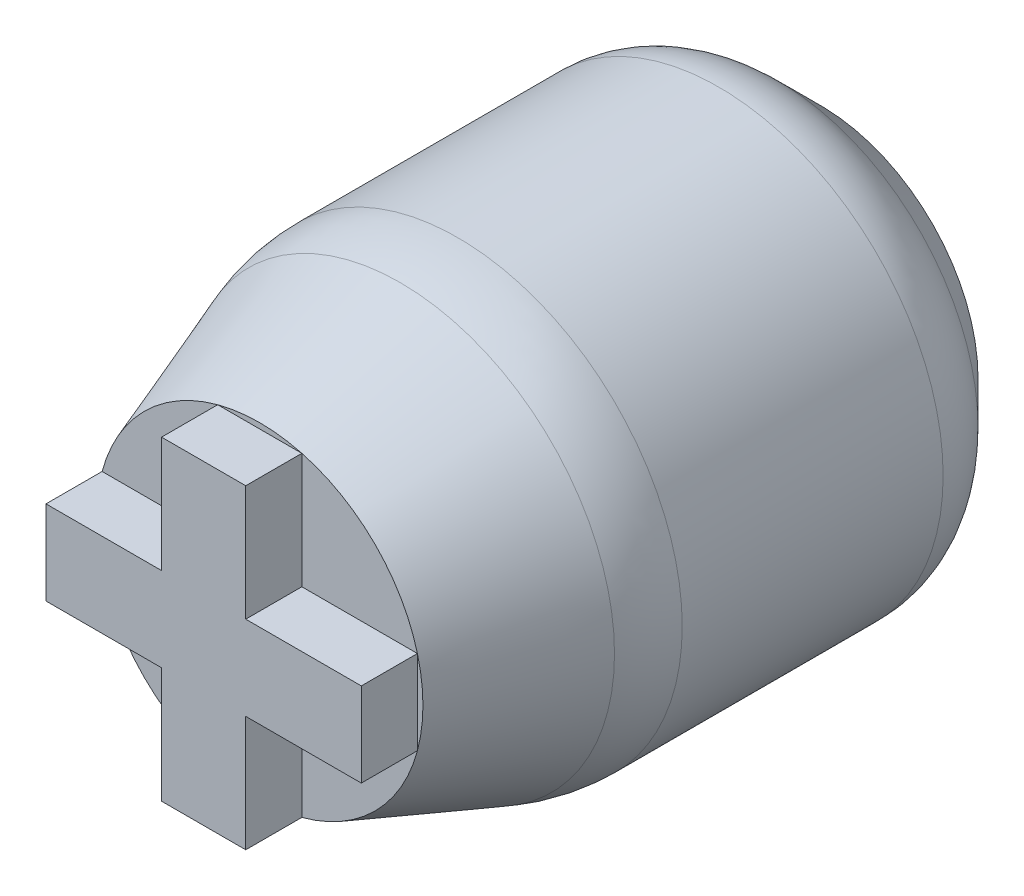
ISO-10303-21;
HEADER;
FILE_DESCRIPTION(('STEP AP214'),'2;1');
FILE_NAME('part.step','',(''),(''),'','','');
FILE_SCHEMA(('AUTOMOTIVE_DESIGN { 1 0 10303 214 1 1 1 1 }'));
ENDSEC;
DATA;
#1=APPLICATION_CONTEXT('core data for automotive mechanical design processes');
#2=APPLICATION_PROTOCOL_DEFINITION('international standard','automotive_design',2000,#1);
#3=PRODUCT_CONTEXT('',#1,'mechanical');
#4=PRODUCT('Part','Part','',(#3));
#5=PRODUCT_RELATED_PRODUCT_CATEGORY('part','',(#4));
#6=PRODUCT_DEFINITION_FORMATION('','',#4);
#7=PRODUCT_DEFINITION_CONTEXT('part definition',#1,'design');
#8=PRODUCT_DEFINITION('design','',#6,#7);
#9=PRODUCT_DEFINITION_SHAPE('','',#8);
#10=(LENGTH_UNIT() NAMED_UNIT(*) SI_UNIT(.MILLI.,.METRE.));
#11=(NAMED_UNIT(*) PLANE_ANGLE_UNIT() SI_UNIT($,.RADIAN.));
#12=(NAMED_UNIT(*) SI_UNIT($,.STERADIAN.) SOLID_ANGLE_UNIT());
#13=UNCERTAINTY_MEASURE_WITH_UNIT(LENGTH_MEASURE(1.E-05),#10,'distance_accuracy_value','');
#14=(GEOMETRIC_REPRESENTATION_CONTEXT(3) GLOBAL_UNCERTAINTY_ASSIGNED_CONTEXT((#13)) GLOBAL_UNIT_ASSIGNED_CONTEXT((#10,
#11,#12)) REPRESENTATION_CONTEXT('',''));
#15=CARTESIAN_POINT('',(0.,0.,0.));
#16=DIRECTION('',(0.,0.,1.));
#17=DIRECTION('',(1.,0.,0.));
#18=AXIS2_PLACEMENT_3D('',#15,#16,#17);
#19=CARTESIAN_POINT('',(0.,0.,10.));
#20=DIRECTION('',(0.,0.,1.));
#21=DIRECTION('',(1.,0.,0.));
#22=AXIS2_PLACEMENT_3D('',#19,#20,#21);
#23=PLANE('',#22);
#24=DIRECTION('',(0.,-1.,0.));
#25=VECTOR('',#24,1.);
#26=CARTESIAN_POINT('',(-2.80971232700027,-0.75,10.));
#27=LINE('',#26,#25);
#28=CARTESIAN_POINT('',(-2.80971232700027,0.75,10.));
#29=VERTEX_POINT('',#28);
#30=CARTESIAN_POINT('',(-2.80971232700027,-0.75,10.));
#31=VERTEX_POINT('',#30);
#32=EDGE_CURVE('E159',#29,#31,#27,.T.);
#33=ORIENTED_EDGE('',*,*,#32,.F.);
#34=CARTESIAN_POINT('',(0.,0.,10.));
#35=DIRECTION('',(0.,0.,1.));
#36=DIRECTION('',(1.,0.,0.));
#37=AXIS2_PLACEMENT_3D('',#34,#35,#36);
#38=CIRCLE('',#37,2.90808929720139);
#39=EDGE_CURVE('E282',#29,#31,#38,.T.);
#40=ORIENTED_EDGE('',*,*,#39,.T.);
#41=EDGE_LOOP('',(#33,#40));
#42=FACE_BOUND('',#41,.T.);
#43=ADVANCED_FACE('F33',(#42),#23,.T.);
#44=DIRECTION('',(-1.,0.,0.));
#45=VECTOR('',#44,1.);
#46=CARTESIAN_POINT('',(-2.80971232700027,0.75,10.));
#47=LINE('',#46,#45);
#48=CARTESIAN_POINT('',(-0.75,0.75,10.));
#49=VERTEX_POINT('',#48);
#50=EDGE_CURVE('E48',#49,#29,#47,.T.);
#51=ORIENTED_EDGE('',*,*,#50,.F.);
#52=DIRECTION('',(0.,-1.,0.));
#53=VECTOR('',#52,1.);
#54=CARTESIAN_POINT('',(-0.75,0.75,10.));
#55=LINE('',#54,#53);
#56=CARTESIAN_POINT('',(-0.750000000000001,2.80971232700027,10.));
#57=VERTEX_POINT('',#56);
#58=EDGE_CURVE('E317',#57,#49,#55,.T.);
#59=ORIENTED_EDGE('',*,*,#58,.F.);
#60=EDGE_CURVE('E597',#57,#29,#38,.T.);
#61=ORIENTED_EDGE('',*,*,#60,.T.);
#62=EDGE_LOOP('',(#51,#59,#61));
#63=FACE_BOUND('',#62,.T.);
#64=ADVANCED_FACE('F235',(#63),#23,.T.);
#65=DIRECTION('',(-1.,0.,0.));
#66=VECTOR('',#65,1.);
#67=CARTESIAN_POINT('',(-0.75,2.80971232700027,10.));
#68=LINE('',#67,#66);
#69=CARTESIAN_POINT('',(0.75,2.80971232700027,10.));
#70=VERTEX_POINT('',#69);
#71=EDGE_CURVE('E319',#70,#57,#68,.T.);
#72=ORIENTED_EDGE('',*,*,#71,.F.);
#73=EDGE_CURVE('E185',#70,#57,#38,.T.);
#74=ORIENTED_EDGE('',*,*,#73,.T.);
#75=EDGE_LOOP('',(#72,#74));
#76=FACE_BOUND('',#75,.T.);
#77=ADVANCED_FACE('F241',(#76),#23,.T.);
#78=DIRECTION('',(0.,1.,0.));
#79=VECTOR('',#78,1.);
#80=CARTESIAN_POINT('',(0.75,2.80971232700027,10.));
#81=LINE('',#80,#79);
#82=CARTESIAN_POINT('',(0.75,0.75,10.));
#83=VERTEX_POINT('',#82);
#84=EDGE_CURVE('E56',#83,#70,#81,.T.);
#85=ORIENTED_EDGE('',*,*,#84,.F.);
#86=DIRECTION('',(-1.,0.,0.));
#87=VECTOR('',#86,1.);
#88=CARTESIAN_POINT('',(0.75,0.75,10.));
#89=LINE('',#88,#87);
#90=CARTESIAN_POINT('',(2.80971232700027,0.750000000000001,10.));
#91=VERTEX_POINT('',#90);
#92=EDGE_CURVE('E323',#91,#83,#89,.T.);
#93=ORIENTED_EDGE('',*,*,#92,.F.);
#94=EDGE_CURVE('E182',#91,#70,#38,.T.);
#95=ORIENTED_EDGE('',*,*,#94,.T.);
#96=EDGE_LOOP('',(#85,#93,#95));
#97=FACE_BOUND('',#96,.T.);
#98=ADVANCED_FACE('F502',(#97),#23,.T.);
#99=DIRECTION('',(0.,1.,0.));
#100=VECTOR('',#99,1.);
#101=CARTESIAN_POINT('',(2.80971232700027,0.75,10.));
#102=LINE('',#101,#100);
#103=CARTESIAN_POINT('',(2.80971232700027,-0.75,10.));
#104=VERTEX_POINT('',#103);
#105=EDGE_CURVE('E325',#104,#91,#102,.T.);
#106=ORIENTED_EDGE('',*,*,#105,.F.);
#107=EDGE_CURVE('E179',#104,#91,#38,.T.);
#108=ORIENTED_EDGE('',*,*,#107,.T.);
#109=EDGE_LOOP('',(#106,#108));
#110=FACE_BOUND('',#109,.T.);
#111=ADVANCED_FACE('F255',(#110),#23,.T.);
#112=DIRECTION('',(1.,0.,0.));
#113=VECTOR('',#112,1.);
#114=CARTESIAN_POINT('',(2.80971232700027,-0.75,10.));
#115=LINE('',#114,#113);
#116=CARTESIAN_POINT('',(0.75,-0.75,10.));
#117=VERTEX_POINT('',#116);
#118=EDGE_CURVE('E328',#117,#104,#115,.T.);
#119=ORIENTED_EDGE('',*,*,#118,.F.);
#120=DIRECTION('',(0.,1.,0.));
#121=VECTOR('',#120,1.);
#122=CARTESIAN_POINT('',(0.75,-0.75,10.));
#123=LINE('',#122,#121);
#124=CARTESIAN_POINT('',(0.750000000000001,-2.80971232700027,10.));
#125=VERTEX_POINT('',#124);
#126=EDGE_CURVE('E266',#125,#117,#123,.T.);
#127=ORIENTED_EDGE('',*,*,#126,.F.);
#128=EDGE_CURVE('E279',#125,#104,#38,.T.);
#129=ORIENTED_EDGE('',*,*,#128,.T.);
#130=EDGE_LOOP('',(#119,#127,#129));
#131=FACE_BOUND('',#130,.T.);
#132=ADVANCED_FACE('F250',(#131),#23,.T.);
#133=DIRECTION('',(1.,0.,0.));
#134=VECTOR('',#133,1.);
#135=CARTESIAN_POINT('',(0.75,-2.80971232700027,10.));
#136=LINE('',#135,#134);
#137=CARTESIAN_POINT('',(-0.75,-2.80971232700027,10.));
#138=VERTEX_POINT('',#137);
#139=EDGE_CURVE('E259',#138,#125,#136,.T.);
#140=ORIENTED_EDGE('',*,*,#139,.F.);
#141=EDGE_CURVE('E261',#138,#125,#38,.T.);
#142=ORIENTED_EDGE('',*,*,#141,.T.);
#143=EDGE_LOOP('',(#140,#142));
#144=FACE_BOUND('',#143,.T.);
#145=ADVANCED_FACE('F202',(#144),#23,.T.);
#146=CARTESIAN_POINT('',(0.,0.,1.82132034355964));
#147=DIRECTION('',(0.,0.,-1.));
#148=DIRECTION('',(-1.,0.,0.));
#149=AXIS2_PLACEMENT_3D('',#146,#147,#148);
#150=TOROIDAL_SURFACE('',#149,2.5,1.5);
#151=CARTESIAN_POINT('',(0.,0.,1.82132034355964));
#152=DIRECTION('',(0.,0.,-1.));
#153=DIRECTION('',(-1.,0.,0.));
#154=AXIS2_PLACEMENT_3D('',#151,#152,#153);
#155=CIRCLE('',#154,4.);
#156=CARTESIAN_POINT('',(-4.,0.,1.82132034355964));
#157=VERTEX_POINT('',#156);
#158=EDGE_CURVE('E41',#157,#157,#155,.F.);
#159=ORIENTED_EDGE('',*,*,#158,.F.);
#160=EDGE_LOOP('',(#159));
#161=FACE_BOUND('',#160,.T.);
#162=CARTESIAN_POINT('',(0.,0.,0.760660171779819));
#163=DIRECTION('',(0.,0.,1.));
#164=DIRECTION('',(1.,0.,0.));
#165=AXIS2_PLACEMENT_3D('',#162,#163,#164);
#166=CIRCLE('',#165,3.56066017177982);
#167=CARTESIAN_POINT('',(3.56066017177982,0.,0.760660171779819));
#168=VERTEX_POINT('',#167);
#169=EDGE_CURVE('E11',#168,#168,#166,.F.);
#170=ORIENTED_EDGE('',*,*,#169,.F.);
#171=EDGE_LOOP('',(#170));
#172=FACE_BOUND('',#171,.T.);
#173=ADVANCED_FACE('F35',(#161,#172),#150,.T.);
#174=CARTESIAN_POINT('',(0.,0.,6.47101905787458));
#175=DIRECTION('',(0.,0.,-1.));
#176=DIRECTION('',(-1.,0.,0.));
#177=AXIS2_PLACEMENT_3D('',#174,#175,#176);
#178=DEGENERATE_TOROIDAL_SURFACE('',#177,1.,3.,.T.);
#179=CARTESIAN_POINT('',(0.,0.,7.49707948785158));
#180=DIRECTION('',(0.,0.,-1.));
#181=DIRECTION('',(-1.,0.,0.));
#182=AXIS2_PLACEMENT_3D('',#179,#180,#181);
#183=CIRCLE('',#182,3.81907786235773);
#184=CARTESIAN_POINT('',(-3.81907786235773,0.,7.49707948785158));
#185=VERTEX_POINT('',#184);
#186=EDGE_CURVE('E188',#185,#185,#183,.F.);
#187=ORIENTED_EDGE('',*,*,#186,.F.);
#188=EDGE_LOOP('',(#187));
#189=FACE_BOUND('',#188,.T.);
#190=CARTESIAN_POINT('',(0.,0.,6.47101905787458));
#191=DIRECTION('',(0.,0.,-1.));
#192=DIRECTION('',(-1.,0.,0.));
#193=AXIS2_PLACEMENT_3D('',#190,#191,#192);
#194=CIRCLE('',#193,4.);
#195=CARTESIAN_POINT('',(-4.,0.,6.47101905787458));
#196=VERTEX_POINT('',#195);
#197=EDGE_CURVE('E191',#196,#196,#194,.T.);
#198=ORIENTED_EDGE('',*,*,#197,.F.);
#199=EDGE_LOOP('',(#198));
#200=FACE_BOUND('',#199,.T.);
#201=ADVANCED_FACE('F201',(#189,#200),#178,.T.);
#202=CARTESIAN_POINT('',(0.,0.,10.));
#203=DIRECTION('',(0.,0.,-1.));
#204=DIRECTION('',(-1.,0.,0.));
#205=AXIS2_PLACEMENT_3D('',#202,#203,#204);
#206=CYLINDRICAL_SURFACE('',#205,4.);
#207=ORIENTED_EDGE('',*,*,#158,.T.);
#208=EDGE_LOOP('',(#207));
#209=FACE_BOUND('',#208,.T.);
#210=ORIENTED_EDGE('',*,*,#197,.T.);
#211=EDGE_LOOP('',(#210));
#212=FACE_BOUND('',#211,.T.);
#213=ADVANCED_FACE('F196',(#209,#212),#206,.T.);
#214=DIRECTION('',(0.,-1.,0.));
#215=VECTOR('',#214,1.);
#216=CARTESIAN_POINT('',(-0.75,-2.80971232700027,10.));
#217=LINE('',#216,#215);
#218=CARTESIAN_POINT('',(-0.75,-0.75,10.));
#219=VERTEX_POINT('',#218);
#220=EDGE_CURVE('E267',#219,#138,#217,.T.);
#221=ORIENTED_EDGE('',*,*,#220,.F.);
#222=DIRECTION('',(1.,0.,0.));
#223=VECTOR('',#222,1.);
#224=CARTESIAN_POINT('',(-0.75,-0.75,10.));
#225=LINE('',#224,#223);
#226=EDGE_CURVE('E281',#31,#219,#225,.T.);
#227=ORIENTED_EDGE('',*,*,#226,.F.);
#228=EDGE_CURVE('E275',#31,#138,#38,.T.);
#229=ORIENTED_EDGE('',*,*,#228,.T.);
#230=EDGE_LOOP('',(#221,#227,#229));
#231=FACE_BOUND('',#230,.T.);
#232=ADVANCED_FACE('F216',(#231),#23,.T.);
#233=CARTESIAN_POINT('',(0.,0.,0.));
#234=DIRECTION('',(0.,0.,1.));
#235=DIRECTION('',(1.,0.,0.));
#236=AXIS2_PLACEMENT_3D('',#233,#234,#235);
#237=PLANE('',#236);
#238=CARTESIAN_POINT('',(0.,0.,0.));
#239=DIRECTION('',(0.,0.,1.));
#240=DIRECTION('',(1.,0.,0.));
#241=AXIS2_PLACEMENT_3D('',#238,#239,#240);
#242=CIRCLE('',#241,2.8);
#243=CARTESIAN_POINT('',(2.8,0.,0.));
#244=VERTEX_POINT('',#243);
#245=EDGE_CURVE('E184',#244,#244,#242,.F.);
#246=ORIENTED_EDGE('',*,*,#245,.T.);
#247=EDGE_LOOP('',(#246));
#248=FACE_BOUND('',#247,.T.);
#249=DIRECTION('',(-1.,0.,0.));
#250=VECTOR('',#249,1.);
#251=CARTESIAN_POINT('',(1.2328828005938,-0.55,0.));
#252=LINE('',#251,#250);
#253=CARTESIAN_POINT('',(1.2328828005938,-0.55,0.));
#254=VERTEX_POINT('',#253);
#255=CARTESIAN_POINT('',(-1.2328828005938,-0.55,0.));
#256=VERTEX_POINT('',#255);
#257=EDGE_CURVE('E162',#254,#256,#252,.T.);
#258=ORIENTED_EDGE('',*,*,#257,.F.);
#259=CARTESIAN_POINT('',(0.,0.,0.));
#260=DIRECTION('',(0.,0.,-1.));
#261=DIRECTION('',(-1.,0.,0.));
#262=AXIS2_PLACEMENT_3D('',#259,#260,#261);
#263=CIRCLE('',#262,1.35);
#264=EDGE_CURVE('E160',#256,#254,#263,.T.);
#265=ORIENTED_EDGE('',*,*,#264,.F.);
#266=EDGE_LOOP('',(#258,#265));
#267=FACE_BOUND('',#266,.T.);
#268=ADVANCED_FACE('F212',(#248,#267),#237,.F.);
#269=CARTESIAN_POINT('',(0.,0.,10.));
#270=DIRECTION('',(0.,0.,-1.));
#271=DIRECTION('',(-1.,0.,0.));
#272=AXIS2_PLACEMENT_3D('',#269,#270,#271);
#273=CONICAL_SURFACE('',#272,2.90808929720139,0.349065850398863);
#274=ORIENTED_EDGE('',*,*,#186,.T.);
#275=EDGE_LOOP('',(#274));
#276=FACE_BOUND('',#275,.T.);
#277=ORIENTED_EDGE('',*,*,#94,.F.);
#278=ORIENTED_EDGE('',*,*,#107,.F.);
#279=ORIENTED_EDGE('',*,*,#128,.F.);
#280=ORIENTED_EDGE('',*,*,#141,.F.);
#281=ORIENTED_EDGE('',*,*,#228,.F.);
#282=ORIENTED_EDGE('',*,*,#39,.F.);
#283=ORIENTED_EDGE('',*,*,#60,.F.);
#284=ORIENTED_EDGE('',*,*,#73,.F.);
#285=EDGE_LOOP('',(#277,#278,#279,#280,#281,#282,#283,#284));
#286=FACE_BOUND('',#285,.T.);
#287=ADVANCED_FACE('F215',(#276,#286),#273,.T.);
#288=CARTESIAN_POINT('',(0.,0.,6.));
#289=DIRECTION('',(0.,0.,-1.));
#290=DIRECTION('',(-1.,0.,0.));
#291=AXIS2_PLACEMENT_3D('',#288,#289,#290);
#292=CYLINDRICAL_SURFACE('',#291,1.35);
#293=ORIENTED_EDGE('',*,*,#264,.T.);
#294=DIRECTION('',(0.,0.,-1.));
#295=VECTOR('',#294,1.);
#296=CARTESIAN_POINT('',(1.2328828005938,-0.55,6.));
#297=LINE('',#296,#295);
#298=CARTESIAN_POINT('',(1.2328828005938,-0.55,6.));
#299=VERTEX_POINT('',#298);
#300=EDGE_CURVE('E173',#299,#254,#297,.T.);
#301=ORIENTED_EDGE('',*,*,#300,.F.);
#302=CARTESIAN_POINT('',(0.,0.,6.));
#303=DIRECTION('',(0.,0.,-1.));
#304=DIRECTION('',(-1.,0.,0.));
#305=AXIS2_PLACEMENT_3D('',#302,#303,#304);
#306=CIRCLE('',#305,1.35);
#307=CARTESIAN_POINT('',(-1.2328828005938,-0.55,6.));
#308=VERTEX_POINT('',#307);
#309=EDGE_CURVE('E168',#308,#299,#306,.T.);
#310=ORIENTED_EDGE('',*,*,#309,.F.);
#311=DIRECTION('',(0.,0.,-1.));
#312=VECTOR('',#311,1.);
#313=CARTESIAN_POINT('',(-1.2328828005938,-0.55,6.));
#314=LINE('',#313,#312);
#315=EDGE_CURVE('E177',#308,#256,#314,.T.);
#316=ORIENTED_EDGE('',*,*,#315,.T.);
#317=EDGE_LOOP('',(#293,#301,#310,#316));
#318=FACE_BOUND('',#317,.T.);
#319=ADVANCED_FACE('F225',(#318),#292,.F.);
#320=CARTESIAN_POINT('',(1.2328828005938,-0.55,6.));
#321=DIRECTION('',(0.,-1.,0.));
#322=DIRECTION('',(0.,0.,-1.));
#323=AXIS2_PLACEMENT_3D('',#320,#321,#322);
#324=PLANE('',#323);
#325=ORIENTED_EDGE('',*,*,#257,.T.);
#326=ORIENTED_EDGE('',*,*,#315,.F.);
#327=DIRECTION('',(-1.,0.,0.));
#328=VECTOR('',#327,1.);
#329=CARTESIAN_POINT('',(1.2328828005938,-0.55,6.));
#330=LINE('',#329,#328);
#331=EDGE_CURVE('E171',#299,#308,#330,.T.);
#332=ORIENTED_EDGE('',*,*,#331,.F.);
#333=ORIENTED_EDGE('',*,*,#300,.T.);
#334=EDGE_LOOP('',(#325,#326,#332,#333));
#335=FACE_BOUND('',#334,.T.);
#336=ADVANCED_FACE('F221',(#335),#324,.F.);
#337=CARTESIAN_POINT('',(0.,0.,6.));
#338=DIRECTION('',(0.,0.,-1.));
#339=DIRECTION('',(-1.,0.,0.));
#340=AXIS2_PLACEMENT_3D('',#337,#338,#339);
#341=PLANE('',#340);
#342=ORIENTED_EDGE('',*,*,#309,.T.);
#343=ORIENTED_EDGE('',*,*,#331,.T.);
#344=EDGE_LOOP('',(#342,#343));
#345=FACE_BOUND('',#344,.T.);
#346=ADVANCED_FACE('F208',(#345),#341,.T.);
#347=CARTESIAN_POINT('',(0.,0.,1.2));
#348=DIRECTION('',(0.,0.,1.));
#349=DIRECTION('',(1.,0.,0.));
#350=AXIS2_PLACEMENT_3D('',#347,#348,#349);
#351=CONICAL_SURFACE('',#350,4.,0.78539816339745);
#352=ORIENTED_EDGE('',*,*,#169,.T.);
#353=EDGE_LOOP('',(#352));
#354=FACE_BOUND('',#353,.T.);
#355=ORIENTED_EDGE('',*,*,#245,.F.);
#356=EDGE_LOOP('',(#355));
#357=FACE_BOUND('',#356,.T.);
#358=ADVANCED_FACE('F205',(#354,#357),#351,.T.);
#359=CARTESIAN_POINT('',(-2.80971232700027,-0.75,11.));
#360=DIRECTION('',(1.,0.,0.));
#361=DIRECTION('',(0.,0.,-1.));
#362=AXIS2_PLACEMENT_3D('',#359,#360,#361);
#363=PLANE('',#362);
#364=ORIENTED_EDGE('',*,*,#32,.T.);
#365=DIRECTION('',(0.,0.,-1.));
#366=VECTOR('',#365,1.);
#367=CARTESIAN_POINT('',(-2.80971232700027,-0.75,11.));
#368=LINE('',#367,#366);
#369=CARTESIAN_POINT('',(-2.80971232700027,-0.75,11.));
#370=VERTEX_POINT('',#369);
#371=EDGE_CURVE('E141',#370,#31,#368,.T.);
#372=ORIENTED_EDGE('',*,*,#371,.F.);
#373=DIRECTION('',(0.,-1.,0.));
#374=VECTOR('',#373,1.);
#375=CARTESIAN_POINT('',(-2.80971232700027,-0.75,11.));
#376=LINE('',#375,#374);
#377=CARTESIAN_POINT('',(-2.80971232700027,0.75,11.));
#378=VERTEX_POINT('',#377);
#379=EDGE_CURVE('E148',#378,#370,#376,.T.);
#380=ORIENTED_EDGE('',*,*,#379,.F.);
#381=DIRECTION('',(0.,0.,-1.));
#382=VECTOR('',#381,1.);
#383=CARTESIAN_POINT('',(-2.80971232700027,0.75,11.));
#384=LINE('',#383,#382);
#385=EDGE_CURVE('E314',#378,#29,#384,.T.);
#386=ORIENTED_EDGE('',*,*,#385,.T.);
#387=EDGE_LOOP('',(#364,#372,#380,#386));
#388=FACE_BOUND('',#387,.T.);
#389=ADVANCED_FACE('F158',(#388),#363,.F.);
#390=CARTESIAN_POINT('',(-0.75,-0.75,11.));
#391=DIRECTION('',(0.,1.,0.));
#392=DIRECTION('',(-1.,0.,0.));
#393=AXIS2_PLACEMENT_3D('',#390,#391,#392);
#394=PLANE('',#393);
#395=ORIENTED_EDGE('',*,*,#226,.T.);
#396=DIRECTION('',(0.,0.,-1.));
#397=VECTOR('',#396,1.);
#398=CARTESIAN_POINT('',(-0.75,-0.75,11.));
#399=LINE('',#398,#397);
#400=CARTESIAN_POINT('',(-0.75,-0.75,11.));
#401=VERTEX_POINT('',#400);
#402=EDGE_CURVE('E144',#401,#219,#399,.T.);
#403=ORIENTED_EDGE('',*,*,#402,.F.);
#404=DIRECTION('',(1.,0.,0.));
#405=VECTOR('',#404,1.);
#406=CARTESIAN_POINT('',(-0.75,-0.75,11.));
#407=LINE('',#406,#405);
#408=EDGE_CURVE('E136',#370,#401,#407,.T.);
#409=ORIENTED_EDGE('',*,*,#408,.F.);
#410=ORIENTED_EDGE('',*,*,#371,.T.);
#411=EDGE_LOOP('',(#395,#403,#409,#410));
#412=FACE_BOUND('',#411,.T.);
#413=ADVANCED_FACE('F139',(#412),#394,.F.);
#414=CARTESIAN_POINT('',(-0.75,-2.80971232700027,11.));
#415=DIRECTION('',(1.,0.,0.));
#416=DIRECTION('',(0.,0.,-1.));
#417=AXIS2_PLACEMENT_3D('',#414,#415,#416);
#418=PLANE('',#417);
#419=ORIENTED_EDGE('',*,*,#220,.T.);
#420=DIRECTION('',(0.,0.,-1.));
#421=VECTOR('',#420,1.);
#422=CARTESIAN_POINT('',(-0.75,-2.80971232700027,11.));
#423=LINE('',#422,#421);
#424=CARTESIAN_POINT('',(-0.75,-2.80971232700027,11.));
#425=VERTEX_POINT('',#424);
#426=EDGE_CURVE('E164',#425,#138,#423,.T.);
#427=ORIENTED_EDGE('',*,*,#426,.F.);
#428=DIRECTION('',(0.,-1.,0.));
#429=VECTOR('',#428,1.);
#430=CARTESIAN_POINT('',(-0.75,-2.80971232700027,11.));
#431=LINE('',#430,#429);
#432=EDGE_CURVE('E147',#401,#425,#431,.T.);
#433=ORIENTED_EDGE('',*,*,#432,.F.);
#434=ORIENTED_EDGE('',*,*,#402,.T.);
#435=EDGE_LOOP('',(#419,#427,#433,#434));
#436=FACE_BOUND('',#435,.T.);
#437=ADVANCED_FACE('F285',(#436),#418,.F.);
#438=CARTESIAN_POINT('',(0.75,-2.80971232700027,11.));
#439=DIRECTION('',(0.,1.,0.));
#440=DIRECTION('',(0.,0.,1.));
#441=AXIS2_PLACEMENT_3D('',#438,#439,#440);
#442=PLANE('',#441);
#443=ORIENTED_EDGE('',*,*,#139,.T.);
#444=DIRECTION('',(0.,0.,-1.));
#445=VECTOR('',#444,1.);
#446=CARTESIAN_POINT('',(0.75,-2.80971232700027,11.));
#447=LINE('',#446,#445);
#448=CARTESIAN_POINT('',(0.75,-2.80971232700027,11.));
#449=VERTEX_POINT('',#448);
#450=EDGE_CURVE('E290',#449,#125,#447,.T.);
#451=ORIENTED_EDGE('',*,*,#450,.F.);
#452=DIRECTION('',(1.,0.,0.));
#453=VECTOR('',#452,1.);
#454=CARTESIAN_POINT('',(0.75,-2.80971232700027,11.));
#455=LINE('',#454,#453);
#456=EDGE_CURVE('E289',#425,#449,#455,.T.);
#457=ORIENTED_EDGE('',*,*,#456,.F.);
#458=ORIENTED_EDGE('',*,*,#426,.T.);
#459=EDGE_LOOP('',(#443,#451,#457,#458));
#460=FACE_BOUND('',#459,.T.);
#461=ADVANCED_FACE('F288',(#460),#442,.F.);
#462=CARTESIAN_POINT('',(0.75,-0.75,11.));
#463=DIRECTION('',(-1.,0.,0.));
#464=DIRECTION('',(0.,-1.,0.));
#465=AXIS2_PLACEMENT_3D('',#462,#463,#464);
#466=PLANE('',#465);
#467=ORIENTED_EDGE('',*,*,#126,.T.);
#468=DIRECTION('',(0.,0.,-1.));
#469=VECTOR('',#468,1.);
#470=CARTESIAN_POINT('',(0.75,-0.75,11.));
#471=LINE('',#470,#469);
#472=CARTESIAN_POINT('',(0.75,-0.75,11.));
#473=VERTEX_POINT('',#472);
#474=EDGE_CURVE('E291',#473,#117,#471,.T.);
#475=ORIENTED_EDGE('',*,*,#474,.F.);
#476=DIRECTION('',(0.,1.,0.));
#477=VECTOR('',#476,1.);
#478=CARTESIAN_POINT('',(0.75,-0.75,11.));
#479=LINE('',#478,#477);
#480=EDGE_CURVE('E348',#449,#473,#479,.T.);
#481=ORIENTED_EDGE('',*,*,#480,.F.);
#482=ORIENTED_EDGE('',*,*,#450,.T.);
#483=EDGE_LOOP('',(#467,#475,#481,#482));
#484=FACE_BOUND('',#483,.T.);
#485=ADVANCED_FACE('F354',(#484),#466,.F.);
#486=CARTESIAN_POINT('',(2.80971232700027,-0.75,11.));
#487=DIRECTION('',(0.,1.,0.));
#488=DIRECTION('',(-1.,0.,0.));
#489=AXIS2_PLACEMENT_3D('',#486,#487,#488);
#490=PLANE('',#489);
#491=ORIENTED_EDGE('',*,*,#118,.T.);
#492=DIRECTION('',(0.,0.,-1.));
#493=VECTOR('',#492,1.);
#494=CARTESIAN_POINT('',(2.80971232700027,-0.75,11.));
#495=LINE('',#494,#493);
#496=CARTESIAN_POINT('',(2.80971232700027,-0.75,11.));
#497=VERTEX_POINT('',#496);
#498=EDGE_CURVE('E296',#497,#104,#495,.T.);
#499=ORIENTED_EDGE('',*,*,#498,.F.);
#500=DIRECTION('',(1.,0.,0.));
#501=VECTOR('',#500,1.);
#502=CARTESIAN_POINT('',(2.80971232700027,-0.75,11.));
#503=LINE('',#502,#501);
#504=EDGE_CURVE('E346',#473,#497,#503,.T.);
#505=ORIENTED_EDGE('',*,*,#504,.F.);
#506=ORIENTED_EDGE('',*,*,#474,.T.);
#507=EDGE_LOOP('',(#491,#499,#505,#506));
#508=FACE_BOUND('',#507,.T.);
#509=ADVANCED_FACE('F358',(#508),#490,.F.);
#510=CARTESIAN_POINT('',(2.80971232700027,0.75,11.));
#511=DIRECTION('',(-1.,0.,0.));
#512=DIRECTION('',(0.,0.,1.));
#513=AXIS2_PLACEMENT_3D('',#510,#511,#512);
#514=PLANE('',#513);
#515=ORIENTED_EDGE('',*,*,#105,.T.);
#516=DIRECTION('',(0.,0.,-1.));
#517=VECTOR('',#516,1.);
#518=CARTESIAN_POINT('',(2.80971232700027,0.75,11.));
#519=LINE('',#518,#517);
#520=CARTESIAN_POINT('',(2.80971232700027,0.75,11.));
#521=VERTEX_POINT('',#520);
#522=EDGE_CURVE('E299',#521,#91,#519,.T.);
#523=ORIENTED_EDGE('',*,*,#522,.F.);
#524=DIRECTION('',(0.,1.,0.));
#525=VECTOR('',#524,1.);
#526=CARTESIAN_POINT('',(2.80971232700027,0.75,11.));
#527=LINE('',#526,#525);
#528=EDGE_CURVE('E344',#497,#521,#527,.T.);
#529=ORIENTED_EDGE('',*,*,#528,.F.);
#530=ORIENTED_EDGE('',*,*,#498,.T.);
#531=EDGE_LOOP('',(#515,#523,#529,#530));
#532=FACE_BOUND('',#531,.T.);
#533=ADVANCED_FACE('F364',(#532),#514,.F.);
#534=CARTESIAN_POINT('',(0.75,0.75,11.));
#535=DIRECTION('',(0.,-1.,0.));
#536=DIRECTION('',(0.,0.,-1.));
#537=AXIS2_PLACEMENT_3D('',#534,#535,#536);
#538=PLANE('',#537);
#539=ORIENTED_EDGE('',*,*,#92,.T.);
#540=DIRECTION('',(0.,0.,-1.));
#541=VECTOR('',#540,1.);
#542=CARTESIAN_POINT('',(0.75,0.75,11.));
#543=LINE('',#542,#541);
#544=CARTESIAN_POINT('',(0.75,0.75,11.));
#545=VERTEX_POINT('',#544);
#546=EDGE_CURVE('E302',#545,#83,#543,.T.);
#547=ORIENTED_EDGE('',*,*,#546,.F.);
#548=DIRECTION('',(-1.,0.,0.));
#549=VECTOR('',#548,1.);
#550=CARTESIAN_POINT('',(0.75,0.75,11.));
#551=LINE('',#550,#549);
#552=EDGE_CURVE('E342',#521,#545,#551,.T.);
#553=ORIENTED_EDGE('',*,*,#552,.F.);
#554=ORIENTED_EDGE('',*,*,#522,.T.);
#555=EDGE_LOOP('',(#539,#547,#553,#554));
#556=FACE_BOUND('',#555,.T.);
#557=ADVANCED_FACE('F366',(#556),#538,.F.);
#558=CARTESIAN_POINT('',(0.75,2.80971232700027,11.));
#559=DIRECTION('',(-1.,0.,0.));
#560=DIRECTION('',(0.,-1.,0.));
#561=AXIS2_PLACEMENT_3D('',#558,#559,#560);
#562=PLANE('',#561);
#563=ORIENTED_EDGE('',*,*,#84,.T.);
#564=DIRECTION('',(0.,0.,-1.));
#565=VECTOR('',#564,1.);
#566=CARTESIAN_POINT('',(0.75,2.80971232700027,11.));
#567=LINE('',#566,#565);
#568=CARTESIAN_POINT('',(0.75,2.80971232700027,11.));
#569=VERTEX_POINT('',#568);
#570=EDGE_CURVE('E305',#569,#70,#567,.T.);
#571=ORIENTED_EDGE('',*,*,#570,.F.);
#572=DIRECTION('',(0.,1.,0.));
#573=VECTOR('',#572,1.);
#574=CARTESIAN_POINT('',(0.75,2.80971232700027,11.));
#575=LINE('',#574,#573);
#576=EDGE_CURVE('E340',#545,#569,#575,.T.);
#577=ORIENTED_EDGE('',*,*,#576,.F.);
#578=ORIENTED_EDGE('',*,*,#546,.T.);
#579=EDGE_LOOP('',(#563,#571,#577,#578));
#580=FACE_BOUND('',#579,.T.);
#581=ADVANCED_FACE('F370',(#580),#562,.F.);
#582=CARTESIAN_POINT('',(-0.75,2.80971232700027,11.));
#583=DIRECTION('',(0.,-1.,0.));
#584=DIRECTION('',(0.,0.,-1.));
#585=AXIS2_PLACEMENT_3D('',#582,#583,#584);
#586=PLANE('',#585);
#587=ORIENTED_EDGE('',*,*,#71,.T.);
#588=DIRECTION('',(0.,0.,-1.));
#589=VECTOR('',#588,1.);
#590=CARTESIAN_POINT('',(-0.75,2.80971232700027,11.));
#591=LINE('',#590,#589);
#592=CARTESIAN_POINT('',(-0.75,2.80971232700027,11.));
#593=VERTEX_POINT('',#592);
#594=EDGE_CURVE('E308',#593,#57,#591,.T.);
#595=ORIENTED_EDGE('',*,*,#594,.F.);
#596=DIRECTION('',(-1.,0.,0.));
#597=VECTOR('',#596,1.);
#598=CARTESIAN_POINT('',(-0.75,2.80971232700027,11.));
#599=LINE('',#598,#597);
#600=EDGE_CURVE('E338',#569,#593,#599,.T.);
#601=ORIENTED_EDGE('',*,*,#600,.F.);
#602=ORIENTED_EDGE('',*,*,#570,.T.);
#603=EDGE_LOOP('',(#587,#595,#601,#602));
#604=FACE_BOUND('',#603,.T.);
#605=ADVANCED_FACE('F376',(#604),#586,.F.);
#606=CARTESIAN_POINT('',(-0.75,0.75,11.));
#607=DIRECTION('',(1.,0.,0.));
#608=DIRECTION('',(0.,1.,0.));
#609=AXIS2_PLACEMENT_3D('',#606,#607,#608);
#610=PLANE('',#609);
#611=ORIENTED_EDGE('',*,*,#58,.T.);
#612=DIRECTION('',(0.,0.,-1.));
#613=VECTOR('',#612,1.);
#614=CARTESIAN_POINT('',(-0.75,0.75,11.));
#615=LINE('',#614,#613);
#616=CARTESIAN_POINT('',(-0.75,0.75,11.));
#617=VERTEX_POINT('',#616);
#618=EDGE_CURVE('E311',#617,#49,#615,.T.);
#619=ORIENTED_EDGE('',*,*,#618,.F.);
#620=DIRECTION('',(0.,-1.,0.));
#621=VECTOR('',#620,1.);
#622=CARTESIAN_POINT('',(-0.75,0.75,11.));
#623=LINE('',#622,#621);
#624=EDGE_CURVE('E336',#593,#617,#623,.T.);
#625=ORIENTED_EDGE('',*,*,#624,.F.);
#626=ORIENTED_EDGE('',*,*,#594,.T.);
#627=EDGE_LOOP('',(#611,#619,#625,#626));
#628=FACE_BOUND('',#627,.T.);
#629=ADVANCED_FACE('F378',(#628),#610,.F.);
#630=CARTESIAN_POINT('',(-2.80971232700027,0.75,11.));
#631=DIRECTION('',(0.,-1.,0.));
#632=DIRECTION('',(1.,0.,0.));
#633=AXIS2_PLACEMENT_3D('',#630,#631,#632);
#634=PLANE('',#633);
#635=ORIENTED_EDGE('',*,*,#50,.T.);
#636=ORIENTED_EDGE('',*,*,#385,.F.);
#637=DIRECTION('',(-1.,0.,0.));
#638=VECTOR('',#637,1.);
#639=CARTESIAN_POINT('',(-2.80971232700027,0.75,11.));
#640=LINE('',#639,#638);
#641=EDGE_CURVE('E153',#617,#378,#640,.T.);
#642=ORIENTED_EDGE('',*,*,#641,.F.);
#643=ORIENTED_EDGE('',*,*,#618,.T.);
#644=EDGE_LOOP('',(#635,#636,#642,#643));
#645=FACE_BOUND('',#644,.T.);
#646=ADVANCED_FACE('F380',(#645),#634,.F.);
#647=CARTESIAN_POINT('',(0.,0.,11.));
#648=DIRECTION('',(0.,0.,-1.));
#649=DIRECTION('',(-1.,0.,0.));
#650=AXIS2_PLACEMENT_3D('',#647,#648,#649);
#651=PLANE('',#650);
#652=ORIENTED_EDGE('',*,*,#379,.T.);
#653=ORIENTED_EDGE('',*,*,#408,.T.);
#654=ORIENTED_EDGE('',*,*,#432,.T.);
#655=ORIENTED_EDGE('',*,*,#456,.T.);
#656=ORIENTED_EDGE('',*,*,#480,.T.);
#657=ORIENTED_EDGE('',*,*,#504,.T.);
#658=ORIENTED_EDGE('',*,*,#528,.T.);
#659=ORIENTED_EDGE('',*,*,#552,.T.);
#660=ORIENTED_EDGE('',*,*,#576,.T.);
#661=ORIENTED_EDGE('',*,*,#600,.T.);
#662=ORIENTED_EDGE('',*,*,#624,.T.);
#663=ORIENTED_EDGE('',*,*,#641,.T.);
#664=EDGE_LOOP('',(#652,#653,#654,#655,#656,#657,#658,#659,#660,#661,#662,#663));
#665=FACE_BOUND('',#664,.T.);
#666=ADVANCED_FACE('F151',(#665),#651,.F.);
#667=CLOSED_SHELL('',(#43,#64,#77,#98,#111,#132,#145,#173,#201,#213,#232,#268,#287,#319,#336,
#346,#358,#389,#413,#437,#461,#485,#509,#533,#557,#581,#605,#629,#646,#666));
#668=MANIFOLD_SOLID_BREP('B2',#667);
#669=ADVANCED_BREP_SHAPE_REPRESENTATION('',(#18,#668),#14);
#670=SHAPE_DEFINITION_REPRESENTATION(#9,#669);
ENDSEC;
END-ISO-10303-21;
